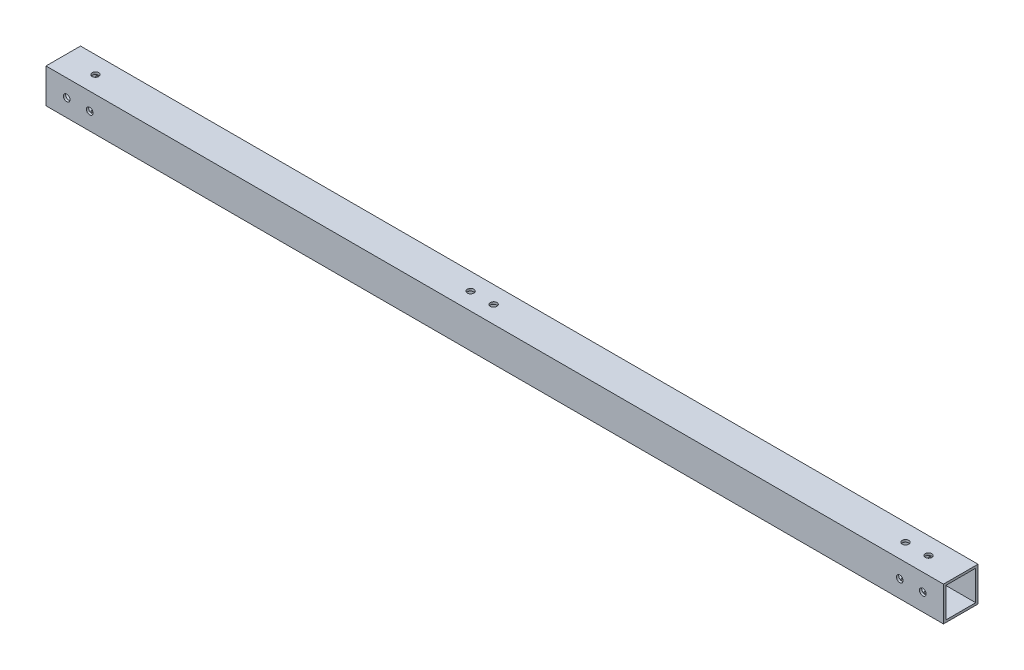
ISO-10303-21;
HEADER;
FILE_DESCRIPTION(('STEP AP214'),'2;1');
FILE_NAME('part.step','',(''),(''),'','','');
FILE_SCHEMA(('AUTOMOTIVE_DESIGN { 1 0 10303 214 1 1 1 1 }'));
ENDSEC;
DATA;
#1=APPLICATION_CONTEXT('core data for automotive mechanical design processes');
#2=APPLICATION_PROTOCOL_DEFINITION('international standard','automotive_design',2000,#1);
#3=PRODUCT_CONTEXT('',#1,'mechanical');
#4=PRODUCT('Part','Part','',(#3));
#5=PRODUCT_RELATED_PRODUCT_CATEGORY('part','',(#4));
#6=PRODUCT_DEFINITION_FORMATION('','',#4);
#7=PRODUCT_DEFINITION_CONTEXT('part definition',#1,'design');
#8=PRODUCT_DEFINITION('design','',#6,#7);
#9=PRODUCT_DEFINITION_SHAPE('','',#8);
#10=(LENGTH_UNIT() NAMED_UNIT(*) SI_UNIT(.MILLI.,.METRE.));
#11=(NAMED_UNIT(*) PLANE_ANGLE_UNIT() SI_UNIT($,.RADIAN.));
#12=(NAMED_UNIT(*) SI_UNIT($,.STERADIAN.) SOLID_ANGLE_UNIT());
#13=UNCERTAINTY_MEASURE_WITH_UNIT(LENGTH_MEASURE(1.E-05),#10,'distance_accuracy_value','');
#14=(GEOMETRIC_REPRESENTATION_CONTEXT(3) GLOBAL_UNCERTAINTY_ASSIGNED_CONTEXT((#13)) GLOBAL_UNIT_ASSIGNED_CONTEXT((#10,
#11,#12)) REPRESENTATION_CONTEXT('',''));
#15=CARTESIAN_POINT('',(0.,0.,0.));
#16=DIRECTION('',(0.,0.,1.));
#17=DIRECTION('',(1.,0.,0.));
#18=AXIS2_PLACEMENT_3D('',#15,#16,#17);
#19=CARTESIAN_POINT('',(390.,0.,0.));
#20=DIRECTION('',(-1.,0.,0.));
#21=DIRECTION('',(0.,0.,1.));
#22=AXIS2_PLACEMENT_3D('',#19,#20,#21);
#23=PLANE('',#22);
#24=DIRECTION('',(0.,1.,0.));
#25=VECTOR('',#24,1.);
#26=CARTESIAN_POINT('',(390.,-7.5,-7.5));
#27=LINE('',#26,#25);
#28=CARTESIAN_POINT('',(390.,-7.5,-7.5));
#29=VERTEX_POINT('',#28);
#30=CARTESIAN_POINT('',(390.,7.5,-7.5));
#31=VERTEX_POINT('',#30);
#32=EDGE_CURVE('E147',#29,#31,#27,.T.);
#33=ORIENTED_EDGE('',*,*,#32,.T.);
#34=DIRECTION('',(0.,0.,1.));
#35=VECTOR('',#34,1.);
#36=CARTESIAN_POINT('',(390.,7.5,7.5));
#37=LINE('',#36,#35);
#38=CARTESIAN_POINT('',(390.,7.5,7.5));
#39=VERTEX_POINT('',#38);
#40=EDGE_CURVE('E150',#31,#39,#37,.T.);
#41=ORIENTED_EDGE('',*,*,#40,.T.);
#42=DIRECTION('',(0.,-1.,0.));
#43=VECTOR('',#42,1.);
#44=CARTESIAN_POINT('',(390.,-7.5,7.5));
#45=LINE('',#44,#43);
#46=CARTESIAN_POINT('',(390.,-7.5,7.5));
#47=VERTEX_POINT('',#46);
#48=EDGE_CURVE('E153',#39,#47,#45,.T.);
#49=ORIENTED_EDGE('',*,*,#48,.T.);
#50=DIRECTION('',(0.,0.,-1.));
#51=VECTOR('',#50,1.);
#52=CARTESIAN_POINT('',(390.,-7.5,7.5));
#53=LINE('',#52,#51);
#54=EDGE_CURVE('E155',#47,#29,#53,.T.);
#55=ORIENTED_EDGE('',*,*,#54,.T.);
#56=EDGE_LOOP('',(#33,#41,#49,#55));
#57=FACE_BOUND('',#56,.T.);
#58=DIRECTION('',(0.,0.,-1.));
#59=VECTOR('',#58,1.);
#60=CARTESIAN_POINT('',(390.,-6.5,6.5));
#61=LINE('',#60,#59);
#62=CARTESIAN_POINT('',(390.,-6.5,6.5));
#63=VERTEX_POINT('',#62);
#64=CARTESIAN_POINT('',(390.,-6.5,-6.5));
#65=VERTEX_POINT('',#64);
#66=EDGE_CURVE('E109',#63,#65,#61,.T.);
#67=ORIENTED_EDGE('',*,*,#66,.F.);
#68=DIRECTION('',(0.,-1.,0.));
#69=VECTOR('',#68,1.);
#70=CARTESIAN_POINT('',(390.,-6.5,6.5));
#71=LINE('',#70,#69);
#72=CARTESIAN_POINT('',(390.,6.5,6.5));
#73=VERTEX_POINT('',#72);
#74=EDGE_CURVE('E131',#73,#63,#71,.T.);
#75=ORIENTED_EDGE('',*,*,#74,.F.);
#76=DIRECTION('',(0.,0.,1.));
#77=VECTOR('',#76,1.);
#78=CARTESIAN_POINT('',(390.,6.5,6.5));
#79=LINE('',#78,#77);
#80=CARTESIAN_POINT('',(390.,6.5,-6.5));
#81=VERTEX_POINT('',#80);
#82=EDGE_CURVE('E129',#81,#73,#79,.T.);
#83=ORIENTED_EDGE('',*,*,#82,.F.);
#84=DIRECTION('',(0.,1.,0.));
#85=VECTOR('',#84,1.);
#86=CARTESIAN_POINT('',(390.,-6.5,-6.5));
#87=LINE('',#86,#85);
#88=EDGE_CURVE('E117',#65,#81,#87,.T.);
#89=ORIENTED_EDGE('',*,*,#88,.F.);
#90=EDGE_LOOP('',(#67,#75,#83,#89));
#91=FACE_BOUND('',#90,.T.);
#92=ADVANCED_FACE('F42',(#57,#91),#23,.F.);
#93=CARTESIAN_POINT('',(0.,0.,0.));
#94=DIRECTION('',(-1.,0.,0.));
#95=DIRECTION('',(0.,0.,1.));
#96=AXIS2_PLACEMENT_3D('',#93,#94,#95);
#97=PLANE('',#96);
#98=DIRECTION('',(0.,1.,0.));
#99=VECTOR('',#98,1.);
#100=CARTESIAN_POINT('',(0.,-7.5,-7.5));
#101=LINE('',#100,#99);
#102=CARTESIAN_POINT('',(0.,-7.5,-7.5));
#103=VERTEX_POINT('',#102);
#104=CARTESIAN_POINT('',(0.,7.5,-7.5));
#105=VERTEX_POINT('',#104);
#106=EDGE_CURVE('E125',#103,#105,#101,.T.);
#107=ORIENTED_EDGE('',*,*,#106,.F.);
#108=DIRECTION('',(0.,0.,-1.));
#109=VECTOR('',#108,1.);
#110=CARTESIAN_POINT('',(0.,-7.5,7.5));
#111=LINE('',#110,#109);
#112=CARTESIAN_POINT('',(0.,-7.5,7.5));
#113=VERTEX_POINT('',#112);
#114=EDGE_CURVE('E151',#113,#103,#111,.T.);
#115=ORIENTED_EDGE('',*,*,#114,.F.);
#116=DIRECTION('',(0.,-1.,0.));
#117=VECTOR('',#116,1.);
#118=CARTESIAN_POINT('',(0.,-7.5,7.5));
#119=LINE('',#118,#117);
#120=CARTESIAN_POINT('',(0.,7.5,7.5));
#121=VERTEX_POINT('',#120);
#122=EDGE_CURVE('E162',#121,#113,#119,.T.);
#123=ORIENTED_EDGE('',*,*,#122,.F.);
#124=DIRECTION('',(0.,0.,1.));
#125=VECTOR('',#124,1.);
#126=CARTESIAN_POINT('',(0.,7.5,7.5));
#127=LINE('',#126,#125);
#128=EDGE_CURVE('E160',#105,#121,#127,.T.);
#129=ORIENTED_EDGE('',*,*,#128,.F.);
#130=EDGE_LOOP('',(#107,#115,#123,#129));
#131=FACE_BOUND('',#130,.T.);
#132=DIRECTION('',(0.,-1.,0.));
#133=VECTOR('',#132,1.);
#134=CARTESIAN_POINT('',(0.,-6.5,6.5));
#135=LINE('',#134,#133);
#136=CARTESIAN_POINT('',(0.,6.5,6.5));
#137=VERTEX_POINT('',#136);
#138=CARTESIAN_POINT('',(0.,-6.5,6.5));
#139=VERTEX_POINT('',#138);
#140=EDGE_CURVE('E118',#137,#139,#135,.T.);
#141=ORIENTED_EDGE('',*,*,#140,.T.);
#142=DIRECTION('',(0.,0.,-1.));
#143=VECTOR('',#142,1.);
#144=CARTESIAN_POINT('',(0.,-6.5,6.5));
#145=LINE('',#144,#143);
#146=CARTESIAN_POINT('',(0.,-6.5,-6.5));
#147=VERTEX_POINT('',#146);
#148=EDGE_CURVE('E67',#139,#147,#145,.T.);
#149=ORIENTED_EDGE('',*,*,#148,.T.);
#150=DIRECTION('',(0.,1.,0.));
#151=VECTOR('',#150,1.);
#152=CARTESIAN_POINT('',(0.,-6.5,-6.5));
#153=LINE('',#152,#151);
#154=CARTESIAN_POINT('',(0.,6.5,-6.5));
#155=VERTEX_POINT('',#154);
#156=EDGE_CURVE('E124',#147,#155,#153,.T.);
#157=ORIENTED_EDGE('',*,*,#156,.T.);
#158=DIRECTION('',(0.,0.,1.));
#159=VECTOR('',#158,1.);
#160=CARTESIAN_POINT('',(0.,6.5,6.5));
#161=LINE('',#160,#159);
#162=EDGE_CURVE('E139',#155,#137,#161,.T.);
#163=ORIENTED_EDGE('',*,*,#162,.T.);
#164=EDGE_LOOP('',(#141,#149,#157,#163));
#165=FACE_BOUND('',#164,.T.);
#166=ADVANCED_FACE('F295',(#131,#165),#97,.T.);
#167=CARTESIAN_POINT('',(390.,-7.5,-7.5));
#168=DIRECTION('',(0.,0.,1.));
#169=DIRECTION('',(1.,0.,0.));
#170=AXIS2_PLACEMENT_3D('',#167,#168,#169);
#171=PLANE('',#170);
#172=CARTESIAN_POINT('',(381.,0.,-7.5));
#173=DIRECTION('',(0.,0.,-1.));
#174=DIRECTION('',(-1.,0.,0.));
#175=AXIS2_PLACEMENT_3D('',#172,#173,#174);
#176=CIRCLE('',#175,1.45);
#177=CARTESIAN_POINT('',(379.55,0.,-7.5));
#178=VERTEX_POINT('',#177);
#179=EDGE_CURVE('E384',#178,#178,#176,.T.);
#180=ORIENTED_EDGE('',*,*,#179,.F.);
#181=EDGE_LOOP('',(#180));
#182=FACE_BOUND('',#181,.T.);
#183=CARTESIAN_POINT('',(19.0000000000001,0.,-7.5));
#184=DIRECTION('',(0.,0.,-1.));
#185=DIRECTION('',(-1.,0.,0.));
#186=AXIS2_PLACEMENT_3D('',#183,#184,#185);
#187=CIRCLE('',#186,1.45);
#188=CARTESIAN_POINT('',(17.5500000000001,0.,-7.5));
#189=VERTEX_POINT('',#188);
#190=EDGE_CURVE('E393',#189,#189,#187,.T.);
#191=ORIENTED_EDGE('',*,*,#190,.F.);
#192=EDGE_LOOP('',(#191));
#193=FACE_BOUND('',#192,.T.);
#194=CARTESIAN_POINT('',(9.00000000000011,0.,-7.5));
#195=DIRECTION('',(0.,0.,-1.));
#196=DIRECTION('',(-1.,0.,0.));
#197=AXIS2_PLACEMENT_3D('',#194,#195,#196);
#198=CIRCLE('',#197,1.45);
#199=CARTESIAN_POINT('',(7.55000000000011,0.,-7.5));
#200=VERTEX_POINT('',#199);
#201=EDGE_CURVE('E402',#200,#200,#198,.T.);
#202=ORIENTED_EDGE('',*,*,#201,.F.);
#203=EDGE_LOOP('',(#202));
#204=FACE_BOUND('',#203,.T.);
#205=CARTESIAN_POINT('',(371.,0.,-7.5));
#206=DIRECTION('',(0.,0.,-1.));
#207=DIRECTION('',(-1.,0.,0.));
#208=AXIS2_PLACEMENT_3D('',#205,#206,#207);
#209=CIRCLE('',#208,1.44999999999994);
#210=CARTESIAN_POINT('',(369.55,0.,-7.5));
#211=VERTEX_POINT('',#210);
#212=EDGE_CURVE('E386',#211,#211,#209,.T.);
#213=ORIENTED_EDGE('',*,*,#212,.F.);
#214=EDGE_LOOP('',(#213));
#215=FACE_BOUND('',#214,.T.);
#216=ORIENTED_EDGE('',*,*,#106,.T.);
#217=DIRECTION('',(-1.,0.,0.));
#218=VECTOR('',#217,1.);
#219=CARTESIAN_POINT('',(390.,7.5,-7.5));
#220=LINE('',#219,#218);
#221=EDGE_CURVE('E11',#31,#105,#220,.T.);
#222=ORIENTED_EDGE('',*,*,#221,.F.);
#223=ORIENTED_EDGE('',*,*,#32,.F.);
#224=DIRECTION('',(-1.,0.,0.));
#225=VECTOR('',#224,1.);
#226=CARTESIAN_POINT('',(390.,-7.5,-7.5));
#227=LINE('',#226,#225);
#228=EDGE_CURVE('E157',#29,#103,#227,.T.);
#229=ORIENTED_EDGE('',*,*,#228,.T.);
#230=EDGE_LOOP('',(#216,#222,#223,#229));
#231=FACE_BOUND('',#230,.T.);
#232=ADVANCED_FACE('F44',(#182,#193,#204,#215,#231),#171,.F.);
#233=CARTESIAN_POINT('',(390.,7.5,7.5));
#234=DIRECTION('',(0.,-1.,0.));
#235=DIRECTION('',(0.,0.,-1.));
#236=AXIS2_PLACEMENT_3D('',#233,#234,#235);
#237=PLANE('',#236);
#238=CARTESIAN_POINT('',(14.0000000000001,7.5,0.));
#239=DIRECTION('',(0.,1.,0.));
#240=DIRECTION('',(0.,0.,1.));
#241=AXIS2_PLACEMENT_3D('',#238,#239,#240);
#242=CIRCLE('',#241,1.45);
#243=CARTESIAN_POINT('',(14.0000000000001,7.5,1.45));
#244=VERTEX_POINT('',#243);
#245=EDGE_CURVE('E220',#244,#244,#242,.T.);
#246=ORIENTED_EDGE('',*,*,#245,.F.);
#247=EDGE_LOOP('',(#246));
#248=FACE_BOUND('',#247,.T.);
#249=CARTESIAN_POINT('',(366.,7.5,0.));
#250=DIRECTION('',(0.,1.,0.));
#251=DIRECTION('',(0.,0.,1.));
#252=AXIS2_PLACEMENT_3D('',#249,#250,#251);
#253=CIRCLE('',#252,1.45);
#254=CARTESIAN_POINT('',(366.,7.5,1.45));
#255=VERTEX_POINT('',#254);
#256=EDGE_CURVE('E223',#255,#255,#253,.T.);
#257=ORIENTED_EDGE('',*,*,#256,.F.);
#258=EDGE_LOOP('',(#257));
#259=FACE_BOUND('',#258,.T.);
#260=CARTESIAN_POINT('',(376.,7.5,0.));
#261=DIRECTION('',(0.,1.,0.));
#262=DIRECTION('',(0.,0.,1.));
#263=AXIS2_PLACEMENT_3D('',#260,#261,#262);
#264=CIRCLE('',#263,1.45);
#265=CARTESIAN_POINT('',(376.,7.5,1.45));
#266=VERTEX_POINT('',#265);
#267=EDGE_CURVE('E229',#266,#266,#264,.T.);
#268=ORIENTED_EDGE('',*,*,#267,.F.);
#269=EDGE_LOOP('',(#268));
#270=FACE_BOUND('',#269,.T.);
#271=CARTESIAN_POINT('',(177.,7.5,0.));
#272=DIRECTION('',(0.,1.,0.));
#273=DIRECTION('',(0.,0.,1.));
#274=AXIS2_PLACEMENT_3D('',#271,#272,#273);
#275=CIRCLE('',#274,1.45);
#276=CARTESIAN_POINT('',(177.,7.5,1.45));
#277=VERTEX_POINT('',#276);
#278=EDGE_CURVE('E235',#277,#277,#275,.T.);
#279=ORIENTED_EDGE('',*,*,#278,.F.);
#280=EDGE_LOOP('',(#279));
#281=FACE_BOUND('',#280,.T.);
#282=CARTESIAN_POINT('',(187.,7.5,0.));
#283=DIRECTION('',(0.,1.,0.));
#284=DIRECTION('',(0.,0.,1.));
#285=AXIS2_PLACEMENT_3D('',#282,#283,#284);
#286=CIRCLE('',#285,1.45);
#287=CARTESIAN_POINT('',(187.,7.5,1.45));
#288=VERTEX_POINT('',#287);
#289=EDGE_CURVE('E241',#288,#288,#286,.T.);
#290=ORIENTED_EDGE('',*,*,#289,.F.);
#291=EDGE_LOOP('',(#290));
#292=FACE_BOUND('',#291,.T.);
#293=ORIENTED_EDGE('',*,*,#128,.T.);
#294=DIRECTION('',(-1.,0.,0.));
#295=VECTOR('',#294,1.);
#296=CARTESIAN_POINT('',(390.,7.5,7.5));
#297=LINE('',#296,#295);
#298=EDGE_CURVE('E51',#39,#121,#297,.T.);
#299=ORIENTED_EDGE('',*,*,#298,.F.);
#300=ORIENTED_EDGE('',*,*,#40,.F.);
#301=ORIENTED_EDGE('',*,*,#221,.T.);
#302=EDGE_LOOP('',(#293,#299,#300,#301));
#303=FACE_BOUND('',#302,.T.);
#304=ADVANCED_FACE('F299',(#248,#259,#270,#281,#292,#303),#237,.F.);
#305=CARTESIAN_POINT('',(390.,-7.5,7.5));
#306=DIRECTION('',(0.,0.,-1.));
#307=DIRECTION('',(-1.,0.,0.));
#308=AXIS2_PLACEMENT_3D('',#305,#306,#307);
#309=PLANE('',#308);
#310=CARTESIAN_POINT('',(381.,0.,7.5));
#311=DIRECTION('',(0.,0.,-1.));
#312=DIRECTION('',(-1.,0.,0.));
#313=AXIS2_PLACEMENT_3D('',#310,#311,#312);
#314=CIRCLE('',#313,1.45);
#315=CARTESIAN_POINT('',(379.55,0.,7.5));
#316=VERTEX_POINT('',#315);
#317=EDGE_CURVE('E196',#316,#316,#314,.T.);
#318=ORIENTED_EDGE('',*,*,#317,.T.);
#319=EDGE_LOOP('',(#318));
#320=FACE_BOUND('',#319,.T.);
#321=CARTESIAN_POINT('',(19.0000000000001,0.,7.5));
#322=DIRECTION('',(0.,0.,-1.));
#323=DIRECTION('',(-1.,0.,0.));
#324=AXIS2_PLACEMENT_3D('',#321,#322,#323);
#325=CIRCLE('',#324,1.45);
#326=CARTESIAN_POINT('',(17.5500000000001,0.,7.5));
#327=VERTEX_POINT('',#326);
#328=EDGE_CURVE('E397',#327,#327,#325,.T.);
#329=ORIENTED_EDGE('',*,*,#328,.T.);
#330=EDGE_LOOP('',(#329));
#331=FACE_BOUND('',#330,.T.);
#332=CARTESIAN_POINT('',(9.00000000000011,0.,7.5));
#333=DIRECTION('',(0.,0.,-1.));
#334=DIRECTION('',(-1.,0.,0.));
#335=AXIS2_PLACEMENT_3D('',#332,#333,#334);
#336=CIRCLE('',#335,1.45);
#337=CARTESIAN_POINT('',(7.55000000000011,0.,7.5));
#338=VERTEX_POINT('',#337);
#339=EDGE_CURVE('E396',#338,#338,#336,.T.);
#340=ORIENTED_EDGE('',*,*,#339,.T.);
#341=EDGE_LOOP('',(#340));
#342=FACE_BOUND('',#341,.T.);
#343=CARTESIAN_POINT('',(371.,0.,7.5));
#344=DIRECTION('',(0.,0.,-1.));
#345=DIRECTION('',(-1.,0.,0.));
#346=AXIS2_PLACEMENT_3D('',#343,#344,#345);
#347=CIRCLE('',#346,1.44999999999994);
#348=CARTESIAN_POINT('',(369.55,0.,7.5));
#349=VERTEX_POINT('',#348);
#350=EDGE_CURVE('E390',#349,#349,#347,.T.);
#351=ORIENTED_EDGE('',*,*,#350,.T.);
#352=EDGE_LOOP('',(#351));
#353=FACE_BOUND('',#352,.T.);
#354=ORIENTED_EDGE('',*,*,#122,.T.);
#355=DIRECTION('',(-1.,0.,0.));
#356=VECTOR('',#355,1.);
#357=CARTESIAN_POINT('',(390.,-7.5,7.5));
#358=LINE('',#357,#356);
#359=EDGE_CURVE('E167',#47,#113,#358,.T.);
#360=ORIENTED_EDGE('',*,*,#359,.F.);
#361=ORIENTED_EDGE('',*,*,#48,.F.);
#362=ORIENTED_EDGE('',*,*,#298,.T.);
#363=EDGE_LOOP('',(#354,#360,#361,#362));
#364=FACE_BOUND('',#363,.T.);
#365=ADVANCED_FACE('F282',(#320,#331,#342,#353,#364),#309,.F.);
#366=CARTESIAN_POINT('',(390.,-7.5,7.5));
#367=DIRECTION('',(0.,1.,0.));
#368=DIRECTION('',(0.,0.,1.));
#369=AXIS2_PLACEMENT_3D('',#366,#367,#368);
#370=PLANE('',#369);
#371=CARTESIAN_POINT('',(14.0000000000001,-7.5,0.));
#372=DIRECTION('',(0.,1.,0.));
#373=DIRECTION('',(0.,0.,1.));
#374=AXIS2_PLACEMENT_3D('',#371,#372,#373);
#375=CIRCLE('',#374,1.45);
#376=CARTESIAN_POINT('',(14.0000000000001,-7.5,1.45));
#377=VERTEX_POINT('',#376);
#378=EDGE_CURVE('E176',#377,#377,#375,.T.);
#379=ORIENTED_EDGE('',*,*,#378,.T.);
#380=EDGE_LOOP('',(#379));
#381=FACE_BOUND('',#380,.T.);
#382=CARTESIAN_POINT('',(366.,-7.5,0.));
#383=DIRECTION('',(0.,1.,0.));
#384=DIRECTION('',(0.,0.,1.));
#385=AXIS2_PLACEMENT_3D('',#382,#383,#384);
#386=CIRCLE('',#385,1.45);
#387=CARTESIAN_POINT('',(366.,-7.5,1.45));
#388=VERTEX_POINT('',#387);
#389=EDGE_CURVE('E226',#388,#388,#386,.T.);
#390=ORIENTED_EDGE('',*,*,#389,.T.);
#391=EDGE_LOOP('',(#390));
#392=FACE_BOUND('',#391,.T.);
#393=CARTESIAN_POINT('',(376.,-7.5,0.));
#394=DIRECTION('',(0.,1.,0.));
#395=DIRECTION('',(0.,0.,1.));
#396=AXIS2_PLACEMENT_3D('',#393,#394,#395);
#397=CIRCLE('',#396,1.45);
#398=CARTESIAN_POINT('',(376.,-7.5,1.45));
#399=VERTEX_POINT('',#398);
#400=EDGE_CURVE('E232',#399,#399,#397,.T.);
#401=ORIENTED_EDGE('',*,*,#400,.T.);
#402=EDGE_LOOP('',(#401));
#403=FACE_BOUND('',#402,.T.);
#404=CARTESIAN_POINT('',(177.,-7.5,0.));
#405=DIRECTION('',(0.,1.,0.));
#406=DIRECTION('',(0.,0.,1.));
#407=AXIS2_PLACEMENT_3D('',#404,#405,#406);
#408=CIRCLE('',#407,1.45);
#409=CARTESIAN_POINT('',(177.,-7.5,1.45));
#410=VERTEX_POINT('',#409);
#411=EDGE_CURVE('E238',#410,#410,#408,.T.);
#412=ORIENTED_EDGE('',*,*,#411,.T.);
#413=EDGE_LOOP('',(#412));
#414=FACE_BOUND('',#413,.T.);
#415=CARTESIAN_POINT('',(187.,-7.5,0.));
#416=DIRECTION('',(0.,1.,0.));
#417=DIRECTION('',(0.,0.,1.));
#418=AXIS2_PLACEMENT_3D('',#415,#416,#417);
#419=CIRCLE('',#418,1.45);
#420=CARTESIAN_POINT('',(187.,-7.5,1.45));
#421=VERTEX_POINT('',#420);
#422=EDGE_CURVE('E217',#421,#421,#419,.T.);
#423=ORIENTED_EDGE('',*,*,#422,.T.);
#424=EDGE_LOOP('',(#423));
#425=FACE_BOUND('',#424,.T.);
#426=ORIENTED_EDGE('',*,*,#114,.T.);
#427=ORIENTED_EDGE('',*,*,#228,.F.);
#428=ORIENTED_EDGE('',*,*,#54,.F.);
#429=ORIENTED_EDGE('',*,*,#359,.T.);
#430=EDGE_LOOP('',(#426,#427,#428,#429));
#431=FACE_BOUND('',#430,.T.);
#432=ADVANCED_FACE('F261',(#381,#392,#403,#414,#425,#431),#370,.F.);
#433=CARTESIAN_POINT('',(390.,-6.5,6.5));
#434=DIRECTION('',(0.,1.,0.));
#435=DIRECTION('',(0.,0.,1.));
#436=AXIS2_PLACEMENT_3D('',#433,#434,#435);
#437=PLANE('',#436);
#438=CARTESIAN_POINT('',(14.0000000000001,-6.5,0.));
#439=DIRECTION('',(0.,1.,0.));
#440=DIRECTION('',(0.,0.,1.));
#441=AXIS2_PLACEMENT_3D('',#438,#439,#440);
#442=CIRCLE('',#441,1.45);
#443=CARTESIAN_POINT('',(14.0000000000001,-6.5,1.45));
#444=VERTEX_POINT('',#443);
#445=EDGE_CURVE('E137',#444,#444,#442,.T.);
#446=ORIENTED_EDGE('',*,*,#445,.F.);
#447=EDGE_LOOP('',(#446));
#448=FACE_BOUND('',#447,.T.);
#449=CARTESIAN_POINT('',(366.,-6.5,0.));
#450=DIRECTION('',(0.,1.,0.));
#451=DIRECTION('',(0.,0.,1.));
#452=AXIS2_PLACEMENT_3D('',#449,#450,#451);
#453=CIRCLE('',#452,1.45);
#454=CARTESIAN_POINT('',(366.,-6.5,1.45));
#455=VERTEX_POINT('',#454);
#456=EDGE_CURVE('E188',#455,#455,#453,.T.);
#457=ORIENTED_EDGE('',*,*,#456,.F.);
#458=EDGE_LOOP('',(#457));
#459=FACE_BOUND('',#458,.T.);
#460=CARTESIAN_POINT('',(376.,-6.5,0.));
#461=DIRECTION('',(0.,1.,0.));
#462=DIRECTION('',(0.,0.,1.));
#463=AXIS2_PLACEMENT_3D('',#460,#461,#462);
#464=CIRCLE('',#463,1.45);
#465=CARTESIAN_POINT('',(376.,-6.5,1.45));
#466=VERTEX_POINT('',#465);
#467=EDGE_CURVE('E184',#466,#466,#464,.T.);
#468=ORIENTED_EDGE('',*,*,#467,.F.);
#469=EDGE_LOOP('',(#468));
#470=FACE_BOUND('',#469,.T.);
#471=CARTESIAN_POINT('',(177.,-6.5,0.));
#472=DIRECTION('',(0.,1.,0.));
#473=DIRECTION('',(0.,0.,1.));
#474=AXIS2_PLACEMENT_3D('',#471,#472,#473);
#475=CIRCLE('',#474,1.45);
#476=CARTESIAN_POINT('',(177.,-6.5,1.45));
#477=VERTEX_POINT('',#476);
#478=EDGE_CURVE('E180',#477,#477,#475,.T.);
#479=ORIENTED_EDGE('',*,*,#478,.F.);
#480=EDGE_LOOP('',(#479));
#481=FACE_BOUND('',#480,.T.);
#482=CARTESIAN_POINT('',(187.,-6.5,0.));
#483=DIRECTION('',(0.,1.,0.));
#484=DIRECTION('',(0.,0.,1.));
#485=AXIS2_PLACEMENT_3D('',#482,#483,#484);
#486=CIRCLE('',#485,1.45);
#487=CARTESIAN_POINT('',(187.,-6.5,1.45));
#488=VERTEX_POINT('',#487);
#489=EDGE_CURVE('E175',#488,#488,#486,.T.);
#490=ORIENTED_EDGE('',*,*,#489,.F.);
#491=EDGE_LOOP('',(#490));
#492=FACE_BOUND('',#491,.T.);
#493=ORIENTED_EDGE('',*,*,#148,.F.);
#494=DIRECTION('',(-1.,0.,0.));
#495=VECTOR('',#494,1.);
#496=CARTESIAN_POINT('',(390.,-6.5,6.5));
#497=LINE('',#496,#495);
#498=EDGE_CURVE('E113',#63,#139,#497,.T.);
#499=ORIENTED_EDGE('',*,*,#498,.F.);
#500=ORIENTED_EDGE('',*,*,#66,.T.);
#501=DIRECTION('',(-1.,0.,0.));
#502=VECTOR('',#501,1.);
#503=CARTESIAN_POINT('',(390.,-6.5,-6.5));
#504=LINE('',#503,#502);
#505=EDGE_CURVE('E112',#65,#147,#504,.T.);
#506=ORIENTED_EDGE('',*,*,#505,.T.);
#507=EDGE_LOOP('',(#493,#499,#500,#506));
#508=FACE_BOUND('',#507,.T.);
#509=ADVANCED_FACE('F111',(#448,#459,#470,#481,#492,#508),#437,.T.);
#510=CARTESIAN_POINT('',(390.,-6.5,-6.5));
#511=DIRECTION('',(0.,0.,1.));
#512=DIRECTION('',(0.,-1.,0.));
#513=AXIS2_PLACEMENT_3D('',#510,#511,#512);
#514=PLANE('',#513);
#515=CARTESIAN_POINT('',(381.,0.,-6.5));
#516=DIRECTION('',(0.,0.,1.));
#517=DIRECTION('',(0.,-1.,0.));
#518=AXIS2_PLACEMENT_3D('',#515,#516,#517);
#519=CIRCLE('',#518,1.45);
#520=CARTESIAN_POINT('',(381.,-1.44999999999995,-6.5));
#521=VERTEX_POINT('',#520);
#522=EDGE_CURVE('E214',#521,#521,#519,.T.);
#523=ORIENTED_EDGE('',*,*,#522,.F.);
#524=EDGE_LOOP('',(#523));
#525=FACE_BOUND('',#524,.T.);
#526=CARTESIAN_POINT('',(19.0000000000001,0.,-6.5));
#527=DIRECTION('',(0.,0.,1.));
#528=DIRECTION('',(0.,-1.,0.));
#529=AXIS2_PLACEMENT_3D('',#526,#527,#528);
#530=CIRCLE('',#529,1.45);
#531=CARTESIAN_POINT('',(19.0000000000001,-1.45,-6.5));
#532=VERTEX_POINT('',#531);
#533=EDGE_CURVE('E202',#532,#532,#530,.T.);
#534=ORIENTED_EDGE('',*,*,#533,.F.);
#535=EDGE_LOOP('',(#534));
#536=FACE_BOUND('',#535,.T.);
#537=CARTESIAN_POINT('',(9.00000000000011,0.,-6.5));
#538=DIRECTION('',(0.,0.,1.));
#539=DIRECTION('',(0.,-1.,0.));
#540=AXIS2_PLACEMENT_3D('',#537,#538,#539);
#541=CIRCLE('',#540,1.45);
#542=CARTESIAN_POINT('',(9.00000000000011,-1.45,-6.5));
#543=VERTEX_POINT('',#542);
#544=EDGE_CURVE('E199',#543,#543,#541,.T.);
#545=ORIENTED_EDGE('',*,*,#544,.F.);
#546=EDGE_LOOP('',(#545));
#547=FACE_BOUND('',#546,.T.);
#548=CARTESIAN_POINT('',(371.,0.,-6.5));
#549=DIRECTION('',(0.,0.,1.));
#550=DIRECTION('',(0.,-1.,0.));
#551=AXIS2_PLACEMENT_3D('',#548,#549,#550);
#552=CIRCLE('',#551,1.44999999999994);
#553=CARTESIAN_POINT('',(371.,-1.44999999999989,-6.5));
#554=VERTEX_POINT('',#553);
#555=EDGE_CURVE('E195',#554,#554,#552,.T.);
#556=ORIENTED_EDGE('',*,*,#555,.F.);
#557=EDGE_LOOP('',(#556));
#558=FACE_BOUND('',#557,.T.);
#559=ORIENTED_EDGE('',*,*,#156,.F.);
#560=ORIENTED_EDGE('',*,*,#505,.F.);
#561=ORIENTED_EDGE('',*,*,#88,.T.);
#562=DIRECTION('',(-1.,0.,0.));
#563=VECTOR('',#562,1.);
#564=CARTESIAN_POINT('',(390.,6.5,-6.5));
#565=LINE('',#564,#563);
#566=EDGE_CURVE('E126',#81,#155,#565,.T.);
#567=ORIENTED_EDGE('',*,*,#566,.T.);
#568=EDGE_LOOP('',(#559,#560,#561,#567));
#569=FACE_BOUND('',#568,.T.);
#570=ADVANCED_FACE('F121',(#525,#536,#547,#558,#569),#514,.T.);
#571=CARTESIAN_POINT('',(390.,6.5,6.5));
#572=DIRECTION('',(0.,-1.,0.));
#573=DIRECTION('',(0.,0.,-1.));
#574=AXIS2_PLACEMENT_3D('',#571,#572,#573);
#575=PLANE('',#574);
#576=CARTESIAN_POINT('',(14.0000000000001,6.5,0.));
#577=DIRECTION('',(0.,-1.,0.));
#578=DIRECTION('',(0.,0.,-1.));
#579=AXIS2_PLACEMENT_3D('',#576,#577,#578);
#580=CIRCLE('',#579,1.45);
#581=CARTESIAN_POINT('',(14.0000000000001,6.5,-1.45));
#582=VERTEX_POINT('',#581);
#583=EDGE_CURVE('E189',#582,#582,#580,.T.);
#584=ORIENTED_EDGE('',*,*,#583,.F.);
#585=EDGE_LOOP('',(#584));
#586=FACE_BOUND('',#585,.T.);
#587=CARTESIAN_POINT('',(366.,6.5,0.));
#588=DIRECTION('',(0.,-1.,0.));
#589=DIRECTION('',(0.,0.,-1.));
#590=AXIS2_PLACEMENT_3D('',#587,#588,#589);
#591=CIRCLE('',#590,1.45);
#592=CARTESIAN_POINT('',(366.,6.5,-1.45));
#593=VERTEX_POINT('',#592);
#594=EDGE_CURVE('E185',#593,#593,#591,.T.);
#595=ORIENTED_EDGE('',*,*,#594,.F.);
#596=EDGE_LOOP('',(#595));
#597=FACE_BOUND('',#596,.T.);
#598=CARTESIAN_POINT('',(376.,6.5,0.));
#599=DIRECTION('',(0.,-1.,0.));
#600=DIRECTION('',(0.,0.,-1.));
#601=AXIS2_PLACEMENT_3D('',#598,#599,#600);
#602=CIRCLE('',#601,1.45);
#603=CARTESIAN_POINT('',(376.,6.5,-1.45));
#604=VERTEX_POINT('',#603);
#605=EDGE_CURVE('E181',#604,#604,#602,.T.);
#606=ORIENTED_EDGE('',*,*,#605,.F.);
#607=EDGE_LOOP('',(#606));
#608=FACE_BOUND('',#607,.T.);
#609=CARTESIAN_POINT('',(177.,6.5,0.));
#610=DIRECTION('',(0.,-1.,0.));
#611=DIRECTION('',(0.,0.,-1.));
#612=AXIS2_PLACEMENT_3D('',#609,#610,#611);
#613=CIRCLE('',#612,1.45);
#614=CARTESIAN_POINT('',(177.,6.5,-1.45));
#615=VERTEX_POINT('',#614);
#616=EDGE_CURVE('E177',#615,#615,#613,.T.);
#617=ORIENTED_EDGE('',*,*,#616,.F.);
#618=EDGE_LOOP('',(#617));
#619=FACE_BOUND('',#618,.T.);
#620=CARTESIAN_POINT('',(187.,6.5,0.));
#621=DIRECTION('',(0.,-1.,0.));
#622=DIRECTION('',(0.,0.,-1.));
#623=AXIS2_PLACEMENT_3D('',#620,#621,#622);
#624=CIRCLE('',#623,1.45);
#625=CARTESIAN_POINT('',(187.,6.5,-1.45));
#626=VERTEX_POINT('',#625);
#627=EDGE_CURVE('E172',#626,#626,#624,.T.);
#628=ORIENTED_EDGE('',*,*,#627,.F.);
#629=EDGE_LOOP('',(#628));
#630=FACE_BOUND('',#629,.T.);
#631=ORIENTED_EDGE('',*,*,#162,.F.);
#632=ORIENTED_EDGE('',*,*,#566,.F.);
#633=ORIENTED_EDGE('',*,*,#82,.T.);
#634=DIRECTION('',(-1.,0.,0.));
#635=VECTOR('',#634,1.);
#636=CARTESIAN_POINT('',(390.,6.5,6.5));
#637=LINE('',#636,#635);
#638=EDGE_CURVE('E59',#73,#137,#637,.T.);
#639=ORIENTED_EDGE('',*,*,#638,.T.);
#640=EDGE_LOOP('',(#631,#632,#633,#639));
#641=FACE_BOUND('',#640,.T.);
#642=ADVANCED_FACE('F322',(#586,#597,#608,#619,#630,#641),#575,.T.);
#643=CARTESIAN_POINT('',(390.,-6.5,6.5));
#644=DIRECTION('',(0.,0.,-1.));
#645=DIRECTION('',(-1.,0.,0.));
#646=AXIS2_PLACEMENT_3D('',#643,#644,#645);
#647=PLANE('',#646);
#648=CARTESIAN_POINT('',(381.,0.,6.5));
#649=DIRECTION('',(0.,0.,-1.));
#650=DIRECTION('',(-1.,0.,0.));
#651=AXIS2_PLACEMENT_3D('',#648,#649,#650);
#652=CIRCLE('',#651,1.45);
#653=CARTESIAN_POINT('',(379.55,0.,6.5));
#654=VERTEX_POINT('',#653);
#655=EDGE_CURVE('E46',#654,#654,#652,.T.);
#656=ORIENTED_EDGE('',*,*,#655,.F.);
#657=EDGE_LOOP('',(#656));
#658=FACE_BOUND('',#657,.T.);
#659=CARTESIAN_POINT('',(19.0000000000001,0.,6.5));
#660=DIRECTION('',(0.,0.,-1.));
#661=DIRECTION('',(-1.,0.,0.));
#662=AXIS2_PLACEMENT_3D('',#659,#660,#661);
#663=CIRCLE('',#662,1.45);
#664=CARTESIAN_POINT('',(17.5500000000001,0.,6.5));
#665=VERTEX_POINT('',#664);
#666=EDGE_CURVE('E200',#665,#665,#663,.T.);
#667=ORIENTED_EDGE('',*,*,#666,.F.);
#668=EDGE_LOOP('',(#667));
#669=FACE_BOUND('',#668,.T.);
#670=CARTESIAN_POINT('',(9.00000000000011,0.,6.5));
#671=DIRECTION('',(0.,0.,-1.));
#672=DIRECTION('',(-1.,0.,0.));
#673=AXIS2_PLACEMENT_3D('',#670,#671,#672);
#674=CIRCLE('',#673,1.45);
#675=CARTESIAN_POINT('',(7.55000000000011,0.,6.5));
#676=VERTEX_POINT('',#675);
#677=EDGE_CURVE('E197',#676,#676,#674,.T.);
#678=ORIENTED_EDGE('',*,*,#677,.F.);
#679=EDGE_LOOP('',(#678));
#680=FACE_BOUND('',#679,.T.);
#681=CARTESIAN_POINT('',(371.,0.,6.5));
#682=DIRECTION('',(0.,0.,-1.));
#683=DIRECTION('',(-1.,0.,0.));
#684=AXIS2_PLACEMENT_3D('',#681,#682,#683);
#685=CIRCLE('',#684,1.44999999999994);
#686=CARTESIAN_POINT('',(369.55,0.,6.5));
#687=VERTEX_POINT('',#686);
#688=EDGE_CURVE('E192',#687,#687,#685,.T.);
#689=ORIENTED_EDGE('',*,*,#688,.F.);
#690=EDGE_LOOP('',(#689));
#691=FACE_BOUND('',#690,.T.);
#692=ORIENTED_EDGE('',*,*,#140,.F.);
#693=ORIENTED_EDGE('',*,*,#638,.F.);
#694=ORIENTED_EDGE('',*,*,#74,.T.);
#695=ORIENTED_EDGE('',*,*,#498,.T.);
#696=EDGE_LOOP('',(#692,#693,#694,#695));
#697=FACE_BOUND('',#696,.T.);
#698=ADVANCED_FACE('F326',(#658,#669,#680,#691,#697),#647,.T.);
#699=CARTESIAN_POINT('',(187.,-7.5,0.));
#700=DIRECTION('',(0.,1.,0.));
#701=DIRECTION('',(0.,0.,1.));
#702=AXIS2_PLACEMENT_3D('',#699,#700,#701);
#703=CYLINDRICAL_SURFACE('',#702,1.45);
#704=ORIENTED_EDGE('',*,*,#627,.T.);
#705=EDGE_LOOP('',(#704));
#706=FACE_BOUND('',#705,.T.);
#707=ORIENTED_EDGE('',*,*,#289,.T.);
#708=EDGE_LOOP('',(#707));
#709=FACE_BOUND('',#708,.T.);
#710=ADVANCED_FACE('F277',(#706,#709),#703,.F.);
#711=CARTESIAN_POINT('',(177.,-7.5,0.));
#712=DIRECTION('',(0.,1.,0.));
#713=DIRECTION('',(0.,0.,1.));
#714=AXIS2_PLACEMENT_3D('',#711,#712,#713);
#715=CYLINDRICAL_SURFACE('',#714,1.45);
#716=ORIENTED_EDGE('',*,*,#616,.T.);
#717=EDGE_LOOP('',(#716));
#718=FACE_BOUND('',#717,.T.);
#719=ORIENTED_EDGE('',*,*,#278,.T.);
#720=EDGE_LOOP('',(#719));
#721=FACE_BOUND('',#720,.T.);
#722=ADVANCED_FACE('F332',(#718,#721),#715,.F.);
#723=CARTESIAN_POINT('',(376.,-7.5,0.));
#724=DIRECTION('',(0.,1.,0.));
#725=DIRECTION('',(0.,0.,1.));
#726=AXIS2_PLACEMENT_3D('',#723,#724,#725);
#727=CYLINDRICAL_SURFACE('',#726,1.45);
#728=ORIENTED_EDGE('',*,*,#605,.T.);
#729=EDGE_LOOP('',(#728));
#730=FACE_BOUND('',#729,.T.);
#731=ORIENTED_EDGE('',*,*,#267,.T.);
#732=EDGE_LOOP('',(#731));
#733=FACE_BOUND('',#732,.T.);
#734=ADVANCED_FACE('F336',(#730,#733),#727,.F.);
#735=CARTESIAN_POINT('',(366.,-7.5,0.));
#736=DIRECTION('',(0.,1.,0.));
#737=DIRECTION('',(0.,0.,1.));
#738=AXIS2_PLACEMENT_3D('',#735,#736,#737);
#739=CYLINDRICAL_SURFACE('',#738,1.45);
#740=ORIENTED_EDGE('',*,*,#594,.T.);
#741=EDGE_LOOP('',(#740));
#742=FACE_BOUND('',#741,.T.);
#743=ORIENTED_EDGE('',*,*,#256,.T.);
#744=EDGE_LOOP('',(#743));
#745=FACE_BOUND('',#744,.T.);
#746=ADVANCED_FACE('F340',(#742,#745),#739,.F.);
#747=CARTESIAN_POINT('',(14.0000000000001,-7.5,0.));
#748=DIRECTION('',(0.,1.,0.));
#749=DIRECTION('',(0.,0.,1.));
#750=AXIS2_PLACEMENT_3D('',#747,#748,#749);
#751=CYLINDRICAL_SURFACE('',#750,1.45);
#752=ORIENTED_EDGE('',*,*,#583,.T.);
#753=EDGE_LOOP('',(#752));
#754=FACE_BOUND('',#753,.T.);
#755=ORIENTED_EDGE('',*,*,#245,.T.);
#756=EDGE_LOOP('',(#755));
#757=FACE_BOUND('',#756,.T.);
#758=ADVANCED_FACE('F275',(#754,#757),#751,.F.);
#759=ORIENTED_EDGE('',*,*,#489,.T.);
#760=EDGE_LOOP('',(#759));
#761=FACE_BOUND('',#760,.T.);
#762=ORIENTED_EDGE('',*,*,#422,.F.);
#763=EDGE_LOOP('',(#762));
#764=FACE_BOUND('',#763,.T.);
#765=ADVANCED_FACE('F271',(#761,#764),#703,.F.);
#766=ORIENTED_EDGE('',*,*,#478,.T.);
#767=EDGE_LOOP('',(#766));
#768=FACE_BOUND('',#767,.T.);
#769=ORIENTED_EDGE('',*,*,#411,.F.);
#770=EDGE_LOOP('',(#769));
#771=FACE_BOUND('',#770,.T.);
#772=ADVANCED_FACE('F274',(#768,#771),#715,.F.);
#773=ORIENTED_EDGE('',*,*,#467,.T.);
#774=EDGE_LOOP('',(#773));
#775=FACE_BOUND('',#774,.T.);
#776=ORIENTED_EDGE('',*,*,#400,.F.);
#777=EDGE_LOOP('',(#776));
#778=FACE_BOUND('',#777,.T.);
#779=ADVANCED_FACE('F342',(#775,#778),#727,.F.);
#780=ORIENTED_EDGE('',*,*,#456,.T.);
#781=EDGE_LOOP('',(#780));
#782=FACE_BOUND('',#781,.T.);
#783=ORIENTED_EDGE('',*,*,#389,.F.);
#784=EDGE_LOOP('',(#783));
#785=FACE_BOUND('',#784,.T.);
#786=ADVANCED_FACE('F346',(#782,#785),#739,.F.);
#787=ORIENTED_EDGE('',*,*,#445,.T.);
#788=EDGE_LOOP('',(#787));
#789=FACE_BOUND('',#788,.T.);
#790=ORIENTED_EDGE('',*,*,#378,.F.);
#791=EDGE_LOOP('',(#790));
#792=FACE_BOUND('',#791,.T.);
#793=ADVANCED_FACE('F256',(#789,#792),#751,.F.);
#794=CARTESIAN_POINT('',(371.,0.,7.5));
#795=DIRECTION('',(0.,0.,-1.));
#796=DIRECTION('',(-1.,0.,0.));
#797=AXIS2_PLACEMENT_3D('',#794,#795,#796);
#798=CYLINDRICAL_SURFACE('',#797,1.44999999999994);
#799=ORIENTED_EDGE('',*,*,#688,.T.);
#800=EDGE_LOOP('',(#799));
#801=FACE_BOUND('',#800,.T.);
#802=ORIENTED_EDGE('',*,*,#350,.F.);
#803=EDGE_LOOP('',(#802));
#804=FACE_BOUND('',#803,.T.);
#805=ADVANCED_FACE('F354',(#801,#804),#798,.F.);
#806=CARTESIAN_POINT('',(9.00000000000011,0.,7.5));
#807=DIRECTION('',(0.,0.,-1.));
#808=DIRECTION('',(-1.,0.,0.));
#809=AXIS2_PLACEMENT_3D('',#806,#807,#808);
#810=CYLINDRICAL_SURFACE('',#809,1.45);
#811=ORIENTED_EDGE('',*,*,#677,.T.);
#812=EDGE_LOOP('',(#811));
#813=FACE_BOUND('',#812,.T.);
#814=ORIENTED_EDGE('',*,*,#339,.F.);
#815=EDGE_LOOP('',(#814));
#816=FACE_BOUND('',#815,.T.);
#817=ADVANCED_FACE('F350',(#813,#816),#810,.F.);
#818=CARTESIAN_POINT('',(19.0000000000001,0.,7.5));
#819=DIRECTION('',(0.,0.,-1.));
#820=DIRECTION('',(-1.,0.,0.));
#821=AXIS2_PLACEMENT_3D('',#818,#819,#820);
#822=CYLINDRICAL_SURFACE('',#821,1.45);
#823=ORIENTED_EDGE('',*,*,#666,.T.);
#824=EDGE_LOOP('',(#823));
#825=FACE_BOUND('',#824,.T.);
#826=ORIENTED_EDGE('',*,*,#328,.F.);
#827=EDGE_LOOP('',(#826));
#828=FACE_BOUND('',#827,.T.);
#829=ADVANCED_FACE('F353',(#825,#828),#822,.F.);
#830=CARTESIAN_POINT('',(381.,0.,7.5));
#831=DIRECTION('',(0.,0.,-1.));
#832=DIRECTION('',(-1.,0.,0.));
#833=AXIS2_PLACEMENT_3D('',#830,#831,#832);
#834=CYLINDRICAL_SURFACE('',#833,1.45);
#835=ORIENTED_EDGE('',*,*,#655,.T.);
#836=EDGE_LOOP('',(#835));
#837=FACE_BOUND('',#836,.T.);
#838=ORIENTED_EDGE('',*,*,#317,.F.);
#839=EDGE_LOOP('',(#838));
#840=FACE_BOUND('',#839,.T.);
#841=ADVANCED_FACE('F363',(#837,#840),#834,.F.);
#842=ORIENTED_EDGE('',*,*,#555,.T.);
#843=EDGE_LOOP('',(#842));
#844=FACE_BOUND('',#843,.T.);
#845=ORIENTED_EDGE('',*,*,#212,.T.);
#846=EDGE_LOOP('',(#845));
#847=FACE_BOUND('',#846,.T.);
#848=ADVANCED_FACE('F360',(#844,#847),#798,.F.);
#849=ORIENTED_EDGE('',*,*,#544,.T.);
#850=EDGE_LOOP('',(#849));
#851=FACE_BOUND('',#850,.T.);
#852=ORIENTED_EDGE('',*,*,#201,.T.);
#853=EDGE_LOOP('',(#852));
#854=FACE_BOUND('',#853,.T.);
#855=ADVANCED_FACE('F356',(#851,#854),#810,.F.);
#856=ORIENTED_EDGE('',*,*,#533,.T.);
#857=EDGE_LOOP('',(#856));
#858=FACE_BOUND('',#857,.T.);
#859=ORIENTED_EDGE('',*,*,#190,.T.);
#860=EDGE_LOOP('',(#859));
#861=FACE_BOUND('',#860,.T.);
#862=ADVANCED_FACE('F364',(#858,#861),#822,.F.);
#863=ORIENTED_EDGE('',*,*,#522,.T.);
#864=EDGE_LOOP('',(#863));
#865=FACE_BOUND('',#864,.T.);
#866=ORIENTED_EDGE('',*,*,#179,.T.);
#867=EDGE_LOOP('',(#866));
#868=FACE_BOUND('',#867,.T.);
#869=ADVANCED_FACE('F367',(#865,#868),#834,.F.);
#870=CLOSED_SHELL('',(#92,#166,#232,#304,#365,#432,#509,#570,#642,#698,#710,#722,#734,#746,#758,
#765,#772,#779,#786,#793,#805,#817,#829,#841,#848,#855,#862,#869));
#871=MANIFOLD_SOLID_BREP('B2',#870);
#872=ADVANCED_BREP_SHAPE_REPRESENTATION('',(#18,#871),#14);
#873=SHAPE_DEFINITION_REPRESENTATION(#9,#872);
ENDSEC;
END-ISO-10303-21;
